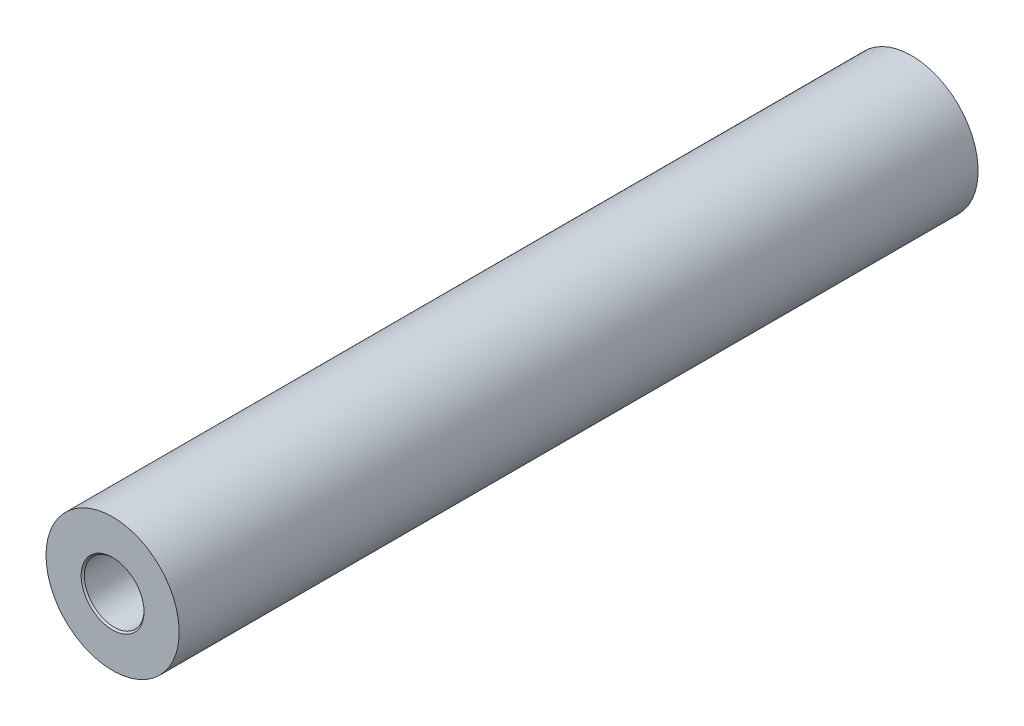
ISO-10303-21;
HEADER;
FILE_DESCRIPTION(('STEP AP214'),'2;1');
FILE_NAME('part.step','',(''),(''),'','','');
FILE_SCHEMA(('AUTOMOTIVE_DESIGN { 1 0 10303 214 1 1 1 1 }'));
ENDSEC;
DATA;
#1=APPLICATION_CONTEXT('core data for automotive mechanical design processes');
#2=APPLICATION_PROTOCOL_DEFINITION('international standard','automotive_design',2000,#1);
#3=PRODUCT_CONTEXT('',#1,'mechanical');
#4=PRODUCT('Part','Part','',(#3));
#5=PRODUCT_RELATED_PRODUCT_CATEGORY('part','',(#4));
#6=PRODUCT_DEFINITION_FORMATION('','',#4);
#7=PRODUCT_DEFINITION_CONTEXT('part definition',#1,'design');
#8=PRODUCT_DEFINITION('design','',#6,#7);
#9=PRODUCT_DEFINITION_SHAPE('','',#8);
#10=(LENGTH_UNIT() NAMED_UNIT(*) SI_UNIT(.MILLI.,.METRE.));
#11=(NAMED_UNIT(*) PLANE_ANGLE_UNIT() SI_UNIT($,.RADIAN.));
#12=(NAMED_UNIT(*) SI_UNIT($,.STERADIAN.) SOLID_ANGLE_UNIT());
#13=UNCERTAINTY_MEASURE_WITH_UNIT(LENGTH_MEASURE(1.E-05),#10,'distance_accuracy_value','');
#14=(GEOMETRIC_REPRESENTATION_CONTEXT(3) GLOBAL_UNCERTAINTY_ASSIGNED_CONTEXT((#13)) GLOBAL_UNIT_ASSIGNED_CONTEXT((#10,
#11,#12)) REPRESENTATION_CONTEXT('',''));
#15=CARTESIAN_POINT('',(0.,0.,0.));
#16=DIRECTION('',(0.,0.,1.));
#17=DIRECTION('',(1.,0.,0.));
#18=AXIS2_PLACEMENT_3D('',#15,#16,#17);
#19=CARTESIAN_POINT('',(0.,0.,19.0499999999999));
#20=DIRECTION('',(0.,0.,-0.999999999999998));
#21=DIRECTION('',(-1.,0.,0.));
#22=AXIS2_PLACEMENT_3D('',#19,#20,#21);
#23=CYLINDRICAL_SURFACE('',#22,3.175);
#24=CARTESIAN_POINT('',(0.,0.,19.0499999999999));
#25=DIRECTION('',(0.,0.,0.999999999999998));
#26=DIRECTION('',(1.,0.,0.));
#27=AXIS2_PLACEMENT_3D('',#24,#25,#26);
#28=CIRCLE('',#27,3.175);
#29=CARTESIAN_POINT('',(-3.17500000000005,0.,19.0499999999999));
#30=VERTEX_POINT('',#29);
#31=EDGE_CURVE('E12',#30,#30,#28,.T.);
#32=CARTESIAN_POINT('',(0.,0.,-19.0499999999999));
#33=DIRECTION('',(0.,0.,0.999999999999998));
#34=DIRECTION('',(1.,0.,0.));
#35=AXIS2_PLACEMENT_3D('',#32,#33,#34);
#36=CIRCLE('',#35,3.175);
#37=CARTESIAN_POINT('',(-3.17500000000006,0.,-19.0499999999999));
#38=VERTEX_POINT('',#37);
#39=EDGE_CURVE('E52',#38,#38,#36,.T.);
#40=CARTESIAN_POINT('',(-3.17500000000005,0.,19.0499999999999));
#41=CARTESIAN_POINT('',(-3.17500000000005,0.,18.6531249999999));
#42=CARTESIAN_POINT('',(-3.17500000000005,0.,18.2562499999999));
#43=CARTESIAN_POINT('',(-3.17500000000005,0.,17.4624999999999));
#44=CARTESIAN_POINT('',(-3.17500000000005,0.,17.0656249999999));
#45=CARTESIAN_POINT('',(-3.17500000000005,0.,16.2718749999999));
#46=CARTESIAN_POINT('',(-3.17500000000005,0.,15.875));
#47=CARTESIAN_POINT('',(-3.17500000000005,0.,15.08125));
#48=CARTESIAN_POINT('',(-3.17500000000006,0.,14.684375));
#49=CARTESIAN_POINT('',(-3.17500000000006,0.,13.890625));
#50=CARTESIAN_POINT('',(-3.17500000000006,0.,13.49375));
#51=CARTESIAN_POINT('',(-3.17500000000006,0.,12.7));
#52=CARTESIAN_POINT('',(-3.17500000000006,0.,12.303125));
#53=CARTESIAN_POINT('',(-3.17500000000006,0.,11.509375));
#54=CARTESIAN_POINT('',(-3.17500000000006,0.,11.1125));
#55=CARTESIAN_POINT('',(-3.17500000000006,0.,10.31875));
#56=CARTESIAN_POINT('',(-3.17500000000006,0.,9.92187499999997));
#57=CARTESIAN_POINT('',(-3.17500000000006,0.,9.12812499999997));
#58=CARTESIAN_POINT('',(-3.17500000000006,0.,8.73124999999998));
#59=CARTESIAN_POINT('',(-3.17500000000006,0.,7.93749999999998));
#60=CARTESIAN_POINT('',(-3.17500000000006,0.,7.54062499999998));
#61=CARTESIAN_POINT('',(-3.17500000000006,0.,6.74687499999998));
#62=CARTESIAN_POINT('',(-3.17500000000006,0.,6.34999999999999));
#63=CARTESIAN_POINT('',(-3.17500000000006,0.,5.55624999999999));
#64=CARTESIAN_POINT('',(-3.17500000000006,0.,5.15937499999999));
#65=CARTESIAN_POINT('',(-3.17500000000006,0.,4.36562499999999));
#66=CARTESIAN_POINT('',(-3.17500000000006,0.,3.96874999999999));
#67=CARTESIAN_POINT('',(-3.17500000000006,0.,3.175));
#68=CARTESIAN_POINT('',(-3.17500000000006,0.,2.778125));
#69=CARTESIAN_POINT('',(-3.17500000000006,0.,1.984375));
#70=CARTESIAN_POINT('',(-3.17500000000006,0.,1.5875));
#71=CARTESIAN_POINT('',(-3.17500000000006,0.,0.793750000000003));
#72=CARTESIAN_POINT('',(-3.17500000000006,0.,0.396875000000005));
#73=CARTESIAN_POINT('',(-3.17500000000006,0.,-0.396874999999991));
#74=CARTESIAN_POINT('',(-3.17500000000006,0.,-0.793749999999989));
#75=CARTESIAN_POINT('',(-3.17500000000006,0.,-1.58749999999999));
#76=CARTESIAN_POINT('',(-3.17500000000006,0.,-1.98437499999999));
#77=CARTESIAN_POINT('',(-3.17500000000006,0.,-2.77812499999999));
#78=CARTESIAN_POINT('',(-3.17500000000006,0.,-3.17499999999998));
#79=CARTESIAN_POINT('',(-3.17500000000006,0.,-3.96874999999998));
#80=CARTESIAN_POINT('',(-3.17500000000006,0.,-4.36562499999998));
#81=CARTESIAN_POINT('',(-3.17500000000006,0.,-5.15937499999998));
#82=CARTESIAN_POINT('',(-3.17500000000006,0.,-5.55624999999997));
#83=CARTESIAN_POINT('',(-3.17500000000006,0.,-6.34999999999997));
#84=CARTESIAN_POINT('',(-3.17500000000006,0.,-6.74687499999997));
#85=CARTESIAN_POINT('',(-3.17500000000006,0.,-7.54062499999997));
#86=CARTESIAN_POINT('',(-3.17500000000006,0.,-7.93749999999997));
#87=CARTESIAN_POINT('',(-3.17500000000006,0.,-8.73124999999997));
#88=CARTESIAN_POINT('',(-3.17500000000006,0.,-9.12812499999996));
#89=CARTESIAN_POINT('',(-3.17500000000006,0.,-9.92187499999996));
#90=CARTESIAN_POINT('',(-3.17500000000006,0.,-10.31875));
#91=CARTESIAN_POINT('',(-3.17500000000006,0.,-11.1125));
#92=CARTESIAN_POINT('',(-3.17500000000006,0.,-11.509375));
#93=CARTESIAN_POINT('',(-3.17500000000006,0.,-12.303125));
#94=CARTESIAN_POINT('',(-3.17500000000006,0.,-12.6999999999999));
#95=CARTESIAN_POINT('',(-3.17500000000006,0.,-13.4937499999999));
#96=CARTESIAN_POINT('',(-3.17500000000006,0.,-13.8906249999999));
#97=CARTESIAN_POINT('',(-3.17500000000006,0.,-14.6843749999999));
#98=CARTESIAN_POINT('',(-3.17500000000006,0.,-15.0812499999999));
#99=CARTESIAN_POINT('',(-3.17500000000006,0.,-15.8749999999999));
#100=CARTESIAN_POINT('',(-3.17500000000006,0.,-16.2718749999999));
#101=CARTESIAN_POINT('',(-3.17500000000006,0.,-17.0656249999999));
#102=CARTESIAN_POINT('',(-3.17500000000006,0.,-17.4624999999999));
#103=CARTESIAN_POINT('',(-3.17500000000006,0.,-18.2562499999999));
#104=CARTESIAN_POINT('',(-3.17500000000006,0.,-18.6531249999999));
#105=CARTESIAN_POINT('',(-3.17500000000006,0.,-19.0499999999999));
#106=B_SPLINE_CURVE_WITH_KNOTS('',3,(#40,#41,#42,#43,#44,#45,#46,#47,#48,#49,#50,#51,#52,#53,
#54,#55,#56,#57,#58,#59,#60,#61,#62,#63,#64,#65,#66,#67,#68,#69,#70,#71,#72,#73,#74,#75,#76,#77,
#78,#79,#80,#81,#82,#83,#84,#85,#86,#87,#88,#89,#90,#91,#92,#93,#94,#95,#96,#97,#98,#99,#100,
#101,#102,#103,#104,#105),.UNSPECIFIED.,.F.,.F.,(4,2,2,2,2,2,2,2,2,2,2,2,2,2,2,2,2,2,2,2,2,2,2,
2,2,2,2,2,2,2,2,2,4),(0.,1.19062499999999,2.38124999999999,3.57187499999998,4.76249999999998,
5.95312499999998,7.14374999999997,8.33437499999997,9.52499999999996,10.715625,11.90625,
13.096875,14.2874999999999,15.4781249999999,16.6687499999999,17.8593749999999,19.0499999999999,
20.2406249999999,21.4312499999999,22.6218749999999,23.8124999999999,25.0031249999999,
26.1937499999999,27.3843749999999,28.5749999999999,29.7656249999999,30.9562499999999,
32.1468749999999,33.3374999999999,34.5281249999999,35.7187499999999,36.9093749999999,
38.0999999999999),.UNSPECIFIED.);
#107=EDGE_CURVE('BSEAM46',#30,#38,#106,.T.);
#108=ORIENTED_EDGE('',*,*,#31,.F.);
#109=ORIENTED_EDGE('',*,*,#39,.T.);
#110=ORIENTED_EDGE('',*,*,#107,.T.);
#111=ORIENTED_EDGE('',*,*,#107,.F.);
#112=EDGE_LOOP('',(#108,#110,#109,#111));
#113=FACE_BOUND('',#112,.T.);
#114=ADVANCED_FACE('F46',(#113),#23,.T.);
#115=CARTESIAN_POINT('',(0.,0.,19.0499999999999));
#116=DIRECTION('',(0.,0.,0.999999999999998));
#117=DIRECTION('',(1.,0.,0.));
#118=AXIS2_PLACEMENT_3D('',#115,#116,#117);
#119=PLANE('',#118);
#120=CARTESIAN_POINT('',(0.,0.,19.0499999999999));
#121=DIRECTION('',(0.,0.,0.999999999999998));
#122=DIRECTION('',(1.,0.,0.));
#123=AXIS2_PLACEMENT_3D('',#120,#121,#122);
#124=CIRCLE('',#123,1.4986);
#125=CARTESIAN_POINT('',(1.49859999999994,0.,19.0499999999999));
#126=VERTEX_POINT('',#125);
#127=EDGE_CURVE('E74',#126,#126,#124,.T.);
#128=ORIENTED_EDGE('',*,*,#127,.F.);
#129=EDGE_LOOP('',(#128));
#130=FACE_BOUND('',#129,.T.);
#131=ORIENTED_EDGE('',*,*,#31,.T.);
#132=EDGE_LOOP('',(#131));
#133=FACE_BOUND('',#132,.T.);
#134=ADVANCED_FACE('F80',(#130,#133),#119,.T.);
#135=CARTESIAN_POINT('',(0.,0.,-19.0499999999999));
#136=DIRECTION('',(0.,0.,0.999999999999998));
#137=DIRECTION('',(1.,0.,0.));
#138=AXIS2_PLACEMENT_3D('',#135,#136,#137);
#139=PLANE('',#138);
#140=CARTESIAN_POINT('',(0.,0.,-19.0499999999999));
#141=DIRECTION('',(0.,0.,-0.999999999999998));
#142=DIRECTION('',(-1.,0.,0.));
#143=AXIS2_PLACEMENT_3D('',#140,#141,#142);
#144=CIRCLE('',#143,1.4986);
#145=CARTESIAN_POINT('',(-1.4986,0.,-19.0499999999999));
#146=VERTEX_POINT('',#145);
#147=EDGE_CURVE('E65',#146,#146,#144,.T.);
#148=ORIENTED_EDGE('',*,*,#147,.F.);
#149=EDGE_LOOP('',(#148));
#150=FACE_BOUND('',#149,.T.);
#151=ORIENTED_EDGE('',*,*,#39,.F.);
#152=EDGE_LOOP('',(#151));
#153=FACE_BOUND('',#152,.T.);
#154=ADVANCED_FACE('F82',(#150,#153),#139,.F.);
#155=CARTESIAN_POINT('',(0.,0.,-12.7));
#156=DIRECTION('',(0.,0.,-0.999999999999998));
#157=DIRECTION('',(-1.,0.,0.));
#158=AXIS2_PLACEMENT_3D('',#155,#156,#157);
#159=CYLINDRICAL_SURFACE('',#158,1.4224);
#160=CARTESIAN_POINT('',(0.,0.,-18.9737999999999));
#161=DIRECTION('',(0.,0.,-0.999999999999998));
#162=DIRECTION('',(-1.,0.,0.));
#163=AXIS2_PLACEMENT_3D('',#160,#161,#162);
#164=CIRCLE('',#163,1.4224);
#165=CARTESIAN_POINT('',(-1.42240000000005,0.,-18.9737999999999));
#166=VERTEX_POINT('',#165);
#167=EDGE_CURVE('E56',#166,#166,#164,.T.);
#168=CARTESIAN_POINT('',(0.,0.,-12.7));
#169=DIRECTION('',(0.,0.,-0.999999999999998));
#170=DIRECTION('',(-1.,0.,0.));
#171=AXIS2_PLACEMENT_3D('',#168,#169,#170);
#172=CIRCLE('',#171,1.4224);
#173=CARTESIAN_POINT('',(-1.42240000000005,0.,-12.7));
#174=VERTEX_POINT('',#173);
#175=EDGE_CURVE('E60',#174,#174,#172,.T.);
#176=CARTESIAN_POINT('',(-1.42240000000005,0.,-18.9737999999999));
#177=CARTESIAN_POINT('',(-1.42240000000005,0.,-18.9084479166666));
#178=CARTESIAN_POINT('',(-1.42240000000005,0.,-18.8430958333333));
#179=CARTESIAN_POINT('',(-1.42240000000005,0.,-18.7123916666666));
#180=CARTESIAN_POINT('',(-1.42240000000005,0.,-18.6470395833333));
#181=CARTESIAN_POINT('',(-1.42240000000005,0.,-18.5163354166666));
#182=CARTESIAN_POINT('',(-1.42240000000005,0.,-18.4509833333333));
#183=CARTESIAN_POINT('',(-1.42240000000005,0.,-18.3202791666666));
#184=CARTESIAN_POINT('',(-1.42240000000005,0.,-18.2549270833333));
#185=CARTESIAN_POINT('',(-1.42240000000005,0.,-18.1242229166666));
#186=CARTESIAN_POINT('',(-1.42240000000005,0.,-18.0588708333333));
#187=CARTESIAN_POINT('',(-1.42240000000005,0.,-17.9281666666666));
#188=CARTESIAN_POINT('',(-1.42240000000005,0.,-17.8628145833333));
#189=CARTESIAN_POINT('',(-1.42240000000005,0.,-17.7321104166666));
#190=CARTESIAN_POINT('',(-1.42240000000005,0.,-17.6667583333333));
#191=CARTESIAN_POINT('',(-1.42240000000005,0.,-17.5360541666666));
#192=CARTESIAN_POINT('',(-1.42240000000005,0.,-17.4707020833333));
#193=CARTESIAN_POINT('',(-1.42240000000005,0.,-17.3399979166666));
#194=CARTESIAN_POINT('',(-1.42240000000005,0.,-17.2746458333333));
#195=CARTESIAN_POINT('',(-1.42240000000005,0.,-17.1439416666666));
#196=CARTESIAN_POINT('',(-1.42240000000005,0.,-17.0785895833333));
#197=CARTESIAN_POINT('',(-1.42240000000005,0.,-16.9478854166666));
#198=CARTESIAN_POINT('',(-1.42240000000005,0.,-16.8825333333333));
#199=CARTESIAN_POINT('',(-1.42240000000005,0.,-16.7518291666666));
#200=CARTESIAN_POINT('',(-1.42240000000005,0.,-16.6864770833333));
#201=CARTESIAN_POINT('',(-1.42240000000005,0.,-16.5557729166666));
#202=CARTESIAN_POINT('',(-1.42240000000005,0.,-16.4904208333333));
#203=CARTESIAN_POINT('',(-1.42240000000005,0.,-16.3597166666666));
#204=CARTESIAN_POINT('',(-1.42240000000005,0.,-16.2943645833333));
#205=CARTESIAN_POINT('',(-1.42240000000005,0.,-16.1636604166666));
#206=CARTESIAN_POINT('',(-1.42240000000005,0.,-16.0983083333333));
#207=CARTESIAN_POINT('',(-1.42240000000005,0.,-15.9676041666666));
#208=CARTESIAN_POINT('',(-1.42240000000005,0.,-15.9022520833333));
#209=CARTESIAN_POINT('',(-1.42240000000005,0.,-15.7715479166666));
#210=CARTESIAN_POINT('',(-1.42240000000005,0.,-15.7061958333333));
#211=CARTESIAN_POINT('',(-1.42240000000005,0.,-15.5754916666666));
#212=CARTESIAN_POINT('',(-1.42240000000005,0.,-15.5101395833333));
#213=CARTESIAN_POINT('',(-1.42240000000005,0.,-15.3794354166666));
#214=CARTESIAN_POINT('',(-1.42240000000005,0.,-15.3140833333333));
#215=CARTESIAN_POINT('',(-1.42240000000005,0.,-15.1833791666666));
#216=CARTESIAN_POINT('',(-1.42240000000005,0.,-15.1180270833333));
#217=CARTESIAN_POINT('',(-1.42240000000005,0.,-14.9873229166666));
#218=CARTESIAN_POINT('',(-1.42240000000005,0.,-14.9219708333333));
#219=CARTESIAN_POINT('',(-1.42240000000005,0.,-14.7912666666666));
#220=CARTESIAN_POINT('',(-1.42240000000005,0.,-14.7259145833333));
#221=CARTESIAN_POINT('',(-1.42240000000005,0.,-14.5952104166666));
#222=CARTESIAN_POINT('',(-1.42240000000005,0.,-14.5298583333333));
#223=CARTESIAN_POINT('',(-1.42240000000005,0.,-14.3991541666666));
#224=CARTESIAN_POINT('',(-1.42240000000005,0.,-14.3338020833333));
#225=CARTESIAN_POINT('',(-1.42240000000005,0.,-14.2030979166666));
#226=CARTESIAN_POINT('',(-1.42240000000005,0.,-14.1377458333333));
#227=CARTESIAN_POINT('',(-1.42240000000005,0.,-14.0070416666666));
#228=CARTESIAN_POINT('',(-1.42240000000005,0.,-13.9416895833333));
#229=CARTESIAN_POINT('',(-1.42240000000005,0.,-13.8109854166666));
#230=CARTESIAN_POINT('',(-1.42240000000005,0.,-13.7456333333333));
#231=CARTESIAN_POINT('',(-1.42240000000005,0.,-13.6149291666666));
#232=CARTESIAN_POINT('',(-1.42240000000005,0.,-13.5495770833333));
#233=CARTESIAN_POINT('',(-1.42240000000005,0.,-13.4188729166666));
#234=CARTESIAN_POINT('',(-1.42240000000005,0.,-13.3535208333333));
#235=CARTESIAN_POINT('',(-1.42240000000005,0.,-13.2228166666666));
#236=CARTESIAN_POINT('',(-1.42240000000005,0.,-13.1574645833333));
#237=CARTESIAN_POINT('',(-1.42240000000005,0.,-13.0267604166666));
#238=CARTESIAN_POINT('',(-1.42240000000005,0.,-12.9614083333333));
#239=CARTESIAN_POINT('',(-1.42240000000005,0.,-12.8307041666666));
#240=CARTESIAN_POINT('',(-1.42240000000005,0.,-12.7653520833333));
#241=CARTESIAN_POINT('',(-1.42240000000005,0.,-12.7));
#242=B_SPLINE_CURVE_WITH_KNOTS('',3,(#176,#177,#178,#179,#180,#181,#182,#183,#184,#185,#186,
#187,#188,#189,#190,#191,#192,#193,#194,#195,#196,#197,#198,#199,#200,#201,#202,#203,#204,#205,
#206,#207,#208,#209,#210,#211,#212,#213,#214,#215,#216,#217,#218,#219,#220,#221,#222,#223,#224,
#225,#226,#227,#228,#229,#230,#231,#232,#233,#234,#235,#236,#237,#238,#239,#240,#241),
.UNSPECIFIED.,.F.,.F.,(4,2,2,2,2,2,2,2,2,2,2,2,2,2,2,2,2,2,2,2,2,2,2,2,2,2,2,2,2,2,2,2,4),(0.,
0.196056249999996,0.392112499999996,0.588168749999996,0.784224999999993,0.980281249999992,
1.17633749999999,1.37239374999999,1.56844999999999,1.76450624999999,1.96056249999999,
2.15661874999998,2.35267499999998,2.54873124999998,2.74478749999998,2.94084374999998,
3.13689999999998,3.33295624999998,3.52901249999998,3.72506874999998,3.92112499999998,
4.11718124999997,4.31323749999997,4.50929374999997,4.70534999999997,4.90140624999997,
5.09746249999997,5.29351874999997,5.48957499999997,5.68563124999997,5.88168749999997,
6.07774374999996,6.27379999999996),.UNSPECIFIED.);
#243=EDGE_CURVE('BSEAM87',#166,#174,#242,.T.);
#244=ORIENTED_EDGE('',*,*,#167,.T.);
#245=ORIENTED_EDGE('',*,*,#175,.F.);
#246=ORIENTED_EDGE('',*,*,#243,.T.);
#247=ORIENTED_EDGE('',*,*,#243,.F.);
#248=EDGE_LOOP('',(#244,#246,#245,#247));
#249=FACE_BOUND('',#248,.T.);
#250=ADVANCED_FACE('F87',(#249),#159,.F.);
#251=CARTESIAN_POINT('',(0.,0.,-12.7));
#252=DIRECTION('',(0.,0.,-0.999999999999998));
#253=DIRECTION('',(-1.,0.,0.));
#254=AXIS2_PLACEMENT_3D('',#251,#252,#253);
#255=PLANE('',#254);
#256=ORIENTED_EDGE('',*,*,#175,.T.);
#257=EDGE_LOOP('',(#256));
#258=FACE_BOUND('',#257,.T.);
#259=ADVANCED_FACE('F94',(#258),#255,.T.);
#260=CARTESIAN_POINT('',(0.,0.,-19.0499999999999));
#261=DIRECTION('',(0.,0.,-0.999999999999998));
#262=DIRECTION('',(-1.,0.,0.));
#263=AXIS2_PLACEMENT_3D('',#260,#261,#262);
#264=CONICAL_SURFACE('',#263,1.4986,0.78539816339745);
#265=CARTESIAN_POINT('',(-1.4224,0.,-18.9737999999999));
#266=CARTESIAN_POINT('',(-1.42319375,0.,-18.9745937499999));
#267=CARTESIAN_POINT('',(-1.4239875,0.,-18.9753874999999));
#268=CARTESIAN_POINT('',(-1.425575,0.,-18.9769749999999));
#269=CARTESIAN_POINT('',(-1.42636875,0.,-18.9777687499999));
#270=CARTESIAN_POINT('',(-1.42795625,0.,-18.9793562499999));
#271=CARTESIAN_POINT('',(-1.42875,0.,-18.9801499999999));
#272=CARTESIAN_POINT('',(-1.4303375,0.,-18.9817374999999));
#273=CARTESIAN_POINT('',(-1.43113125,0.,-18.9825312499999));
#274=CARTESIAN_POINT('',(-1.43271875,0.,-18.9841187499999));
#275=CARTESIAN_POINT('',(-1.4335125,0.,-18.9849124999999));
#276=CARTESIAN_POINT('',(-1.4351,0.,-18.9864999999999));
#277=CARTESIAN_POINT('',(-1.43589375,0.,-18.9872937499999));
#278=CARTESIAN_POINT('',(-1.43748125,0.,-18.9888812499999));
#279=CARTESIAN_POINT('',(-1.438275,0.,-18.9896749999999));
#280=CARTESIAN_POINT('',(-1.4398625,0.,-18.9912624999999));
#281=CARTESIAN_POINT('',(-1.44065625,0.,-18.9920562499999));
#282=CARTESIAN_POINT('',(-1.44224375,0.,-18.9936437499999));
#283=CARTESIAN_POINT('',(-1.4430375,0.,-18.9944374999999));
#284=CARTESIAN_POINT('',(-1.444625,0.,-18.9960249999999));
#285=CARTESIAN_POINT('',(-1.44541875,0.,-18.9968187499999));
#286=CARTESIAN_POINT('',(-1.44700625,0.,-18.9984062499999));
#287=CARTESIAN_POINT('',(-1.4478,0.,-18.9991999999999));
#288=CARTESIAN_POINT('',(-1.4493875,0.,-19.0007874999999));
#289=CARTESIAN_POINT('',(-1.45018125,0.,-19.0015812499999));
#290=CARTESIAN_POINT('',(-1.45176875,0.,-19.0031687499999));
#291=CARTESIAN_POINT('',(-1.4525625,0.,-19.0039624999999));
#292=CARTESIAN_POINT('',(-1.45415,0.,-19.0055499999999));
#293=CARTESIAN_POINT('',(-1.45494375,0.,-19.0063437499999));
#294=CARTESIAN_POINT('',(-1.45653125,0.,-19.0079312499999));
#295=CARTESIAN_POINT('',(-1.457325,0.,-19.0087249999999));
#296=CARTESIAN_POINT('',(-1.4589125,0.,-19.0103124999999));
#297=CARTESIAN_POINT('',(-1.45970625,0.,-19.0111062499999));
#298=CARTESIAN_POINT('',(-1.46129375,0.,-19.0126937499999));
#299=CARTESIAN_POINT('',(-1.4620875,0.,-19.0134874999999));
#300=CARTESIAN_POINT('',(-1.463675,0.,-19.0150749999999));
#301=CARTESIAN_POINT('',(-1.46446875,0.,-19.0158687499999));
#302=CARTESIAN_POINT('',(-1.46605625,0.,-19.0174562499999));
#303=CARTESIAN_POINT('',(-1.46685,0.,-19.0182499999999));
#304=CARTESIAN_POINT('',(-1.4684375,0.,-19.0198374999999));
#305=CARTESIAN_POINT('',(-1.46923125,0.,-19.0206312499999));
#306=CARTESIAN_POINT('',(-1.47081875,0.,-19.0222187499999));
#307=CARTESIAN_POINT('',(-1.4716125,0.,-19.0230124999999));
#308=CARTESIAN_POINT('',(-1.4732,0.,-19.0245999999999));
#309=CARTESIAN_POINT('',(-1.47399375,0.,-19.0253937499999));
#310=CARTESIAN_POINT('',(-1.47558125,0.,-19.0269812499999));
#311=CARTESIAN_POINT('',(-1.476375,0.,-19.0277749999999));
#312=CARTESIAN_POINT('',(-1.4779625,0.,-19.0293624999999));
#313=CARTESIAN_POINT('',(-1.47875625,0.,-19.0301562499999));
#314=CARTESIAN_POINT('',(-1.48034375,0.,-19.0317437499999));
#315=CARTESIAN_POINT('',(-1.4811375,0.,-19.0325374999999));
#316=CARTESIAN_POINT('',(-1.482725,0.,-19.0341249999999));
#317=CARTESIAN_POINT('',(-1.48351875,0.,-19.0349187499999));
#318=CARTESIAN_POINT('',(-1.48510625,0.,-19.0365062499999));
#319=CARTESIAN_POINT('',(-1.4859,0.,-19.0372999999999));
#320=CARTESIAN_POINT('',(-1.4874875,0.,-19.0388874999999));
#321=CARTESIAN_POINT('',(-1.48828125,0.,-19.0396812499999));
#322=CARTESIAN_POINT('',(-1.48986875,0.,-19.0412687499999));
#323=CARTESIAN_POINT('',(-1.4906625,0.,-19.0420624999999));
#324=CARTESIAN_POINT('',(-1.49225,0.,-19.0436499999999));
#325=CARTESIAN_POINT('',(-1.49304375,0.,-19.0444437499999));
#326=CARTESIAN_POINT('',(-1.49463125,0.,-19.0460312499999));
#327=CARTESIAN_POINT('',(-1.495425,0.,-19.0468249999999));
#328=CARTESIAN_POINT('',(-1.4970125,0.,-19.0484124999999));
#329=CARTESIAN_POINT('',(-1.49780625,0.,-19.0492062499999));
#330=CARTESIAN_POINT('',(-1.4986,0.,-19.0499999999999));
#331=B_SPLINE_CURVE_WITH_KNOTS('',3,(#265,#266,#267,#268,#269,#270,#271,#272,#273,#274,#275,
#276,#277,#278,#279,#280,#281,#282,#283,#284,#285,#286,#287,#288,#289,#290,#291,#292,#293,#294,
#295,#296,#297,#298,#299,#300,#301,#302,#303,#304,#305,#306,#307,#308,#309,#310,#311,#312,#313,
#314,#315,#316,#317,#318,#319,#320,#321,#322,#323,#324,#325,#326,#327,#328,#329,#330),
.UNSPECIFIED.,.F.,.F.,(4,2,2,2,2,2,2,2,2,2,2,2,2,2,2,2,2,2,2,2,2,2,2,2,2,2,2,2,2,2,2,2,4),(0.,
0.00336759604540271,0.00673519209080296,0.0101027881362032,0.0134703841816059,
0.0168379802270062,0.0202055762724064,0.0235731723178067,0.0269407683632094,0.0303083644086098,
0.03367596045401,0.0370435564994103,0.040411152544813,0.0437787485902133,0.0471463446356135,
0.0505139406810138,0.053881536726414,0.0572491327718167,0.0606167288172168,0.0639843248626171,
0.0673519209080198,0.07071951695342,0.0740871129988203,0.0774547090442205,0.0808223050896209,
0.0841899011350236,0.0875574971804239,0.0909250932258241,0.0942926892712244,0.0976602853166271,
0.101027881362027,0.104395477407428,0.10776307345283),.UNSPECIFIED.);
#332=EDGE_CURVE('BSEAM98',#166,#146,#331,.T.);
#333=ORIENTED_EDGE('',*,*,#167,.F.);
#334=ORIENTED_EDGE('',*,*,#147,.T.);
#335=ORIENTED_EDGE('',*,*,#332,.T.);
#336=ORIENTED_EDGE('',*,*,#332,.F.);
#337=EDGE_LOOP('',(#333,#335,#334,#336));
#338=FACE_BOUND('',#337,.T.);
#339=ADVANCED_FACE('F98',(#338),#264,.F.);
#340=CARTESIAN_POINT('',(0.,0.,12.6999999999999));
#341=DIRECTION('',(0.,0.,0.999999999999998));
#342=DIRECTION('',(1.,0.,0.));
#343=AXIS2_PLACEMENT_3D('',#340,#341,#342);
#344=CYLINDRICAL_SURFACE('',#343,1.4224);
#345=CARTESIAN_POINT('',(0.,0.,18.9737999999999));
#346=DIRECTION('',(0.,0.,0.999999999999998));
#347=DIRECTION('',(1.,0.,0.));
#348=AXIS2_PLACEMENT_3D('',#345,#346,#347);
#349=CIRCLE('',#348,1.4224);
#350=CARTESIAN_POINT('',(1.42239999999996,0.,18.9737999999999));
#351=VERTEX_POINT('',#350);
#352=EDGE_CURVE('E68',#351,#351,#349,.T.);
#353=CARTESIAN_POINT('',(0.,0.,12.6999999999999));
#354=DIRECTION('',(0.,0.,0.999999999999998));
#355=DIRECTION('',(1.,0.,0.));
#356=AXIS2_PLACEMENT_3D('',#353,#354,#355);
#357=CIRCLE('',#356,1.4224);
#358=CARTESIAN_POINT('',(1.42239999999996,0.,12.6999999999999));
#359=VERTEX_POINT('',#358);
#360=EDGE_CURVE('E71',#359,#359,#357,.T.);
#361=CARTESIAN_POINT('',(1.42239999999996,0.,18.9737999999999));
#362=CARTESIAN_POINT('',(1.42239999999996,0.,18.9084479166666));
#363=CARTESIAN_POINT('',(1.42239999999996,0.,18.8430958333333));
#364=CARTESIAN_POINT('',(1.42239999999996,0.,18.7123916666666));
#365=CARTESIAN_POINT('',(1.42239999999996,0.,18.6470395833333));
#366=CARTESIAN_POINT('',(1.42239999999996,0.,18.5163354166666));
#367=CARTESIAN_POINT('',(1.42239999999996,0.,18.4509833333333));
#368=CARTESIAN_POINT('',(1.42239999999996,0.,18.3202791666666));
#369=CARTESIAN_POINT('',(1.42239999999996,0.,18.2549270833333));
#370=CARTESIAN_POINT('',(1.42239999999996,0.,18.1242229166666));
#371=CARTESIAN_POINT('',(1.42239999999996,0.,18.0588708333333));
#372=CARTESIAN_POINT('',(1.42239999999996,0.,17.9281666666666));
#373=CARTESIAN_POINT('',(1.42239999999996,0.,17.8628145833333));
#374=CARTESIAN_POINT('',(1.42239999999996,0.,17.7321104166666));
#375=CARTESIAN_POINT('',(1.42239999999996,0.,17.6667583333333));
#376=CARTESIAN_POINT('',(1.42239999999996,0.,17.5360541666666));
#377=CARTESIAN_POINT('',(1.42239999999996,0.,17.4707020833333));
#378=CARTESIAN_POINT('',(1.42239999999996,0.,17.3399979166666));
#379=CARTESIAN_POINT('',(1.42239999999996,0.,17.2746458333333));
#380=CARTESIAN_POINT('',(1.42239999999996,0.,17.1439416666666));
#381=CARTESIAN_POINT('',(1.42239999999996,0.,17.0785895833333));
#382=CARTESIAN_POINT('',(1.42239999999996,0.,16.9478854166666));
#383=CARTESIAN_POINT('',(1.42239999999996,0.,16.8825333333333));
#384=CARTESIAN_POINT('',(1.42239999999996,0.,16.7518291666666));
#385=CARTESIAN_POINT('',(1.42239999999996,0.,16.6864770833333));
#386=CARTESIAN_POINT('',(1.42239999999996,0.,16.5557729166666));
#387=CARTESIAN_POINT('',(1.42239999999996,0.,16.4904208333333));
#388=CARTESIAN_POINT('',(1.42239999999996,0.,16.3597166666666));
#389=CARTESIAN_POINT('',(1.42239999999996,0.,16.2943645833333));
#390=CARTESIAN_POINT('',(1.42239999999996,0.,16.1636604166666));
#391=CARTESIAN_POINT('',(1.42239999999996,0.,16.0983083333333));
#392=CARTESIAN_POINT('',(1.42239999999996,0.,15.9676041666666));
#393=CARTESIAN_POINT('',(1.42239999999996,0.,15.9022520833333));
#394=CARTESIAN_POINT('',(1.42239999999996,0.,15.7715479166666));
#395=CARTESIAN_POINT('',(1.42239999999996,0.,15.7061958333333));
#396=CARTESIAN_POINT('',(1.42239999999996,0.,15.5754916666666));
#397=CARTESIAN_POINT('',(1.42239999999996,0.,15.5101395833333));
#398=CARTESIAN_POINT('',(1.42239999999996,0.,15.3794354166666));
#399=CARTESIAN_POINT('',(1.42239999999996,0.,15.3140833333333));
#400=CARTESIAN_POINT('',(1.42239999999996,0.,15.1833791666666));
#401=CARTESIAN_POINT('',(1.42239999999996,0.,15.1180270833333));
#402=CARTESIAN_POINT('',(1.42239999999996,0.,14.9873229166666));
#403=CARTESIAN_POINT('',(1.42239999999996,0.,14.9219708333333));
#404=CARTESIAN_POINT('',(1.42239999999996,0.,14.7912666666666));
#405=CARTESIAN_POINT('',(1.42239999999996,0.,14.7259145833333));
#406=CARTESIAN_POINT('',(1.42239999999996,0.,14.5952104166666));
#407=CARTESIAN_POINT('',(1.42239999999996,0.,14.5298583333333));
#408=CARTESIAN_POINT('',(1.42239999999996,0.,14.3991541666666));
#409=CARTESIAN_POINT('',(1.42239999999996,0.,14.3338020833333));
#410=CARTESIAN_POINT('',(1.42239999999996,0.,14.2030979166666));
#411=CARTESIAN_POINT('',(1.42239999999996,0.,14.1377458333333));
#412=CARTESIAN_POINT('',(1.42239999999996,0.,14.0070416666666));
#413=CARTESIAN_POINT('',(1.42239999999996,0.,13.9416895833333));
#414=CARTESIAN_POINT('',(1.42239999999996,0.,13.8109854166666));
#415=CARTESIAN_POINT('',(1.42239999999996,0.,13.7456333333333));
#416=CARTESIAN_POINT('',(1.42239999999996,0.,13.6149291666666));
#417=CARTESIAN_POINT('',(1.42239999999996,0.,13.5495770833333));
#418=CARTESIAN_POINT('',(1.42239999999996,0.,13.4188729166666));
#419=CARTESIAN_POINT('',(1.42239999999996,0.,13.3535208333333));
#420=CARTESIAN_POINT('',(1.42239999999996,0.,13.2228166666666));
#421=CARTESIAN_POINT('',(1.42239999999996,0.,13.1574645833333));
#422=CARTESIAN_POINT('',(1.42239999999996,0.,13.0267604166666));
#423=CARTESIAN_POINT('',(1.42239999999996,0.,12.9614083333333));
#424=CARTESIAN_POINT('',(1.42239999999996,0.,12.8307041666666));
#425=CARTESIAN_POINT('',(1.42239999999996,0.,12.7653520833333));
#426=CARTESIAN_POINT('',(1.42239999999996,0.,12.6999999999999));
#427=B_SPLINE_CURVE_WITH_KNOTS('',3,(#361,#362,#363,#364,#365,#366,#367,#368,#369,#370,#371,
#372,#373,#374,#375,#376,#377,#378,#379,#380,#381,#382,#383,#384,#385,#386,#387,#388,#389,#390,
#391,#392,#393,#394,#395,#396,#397,#398,#399,#400,#401,#402,#403,#404,#405,#406,#407,#408,#409,
#410,#411,#412,#413,#414,#415,#416,#417,#418,#419,#420,#421,#422,#423,#424,#425,#426),
.UNSPECIFIED.,.F.,.F.,(4,2,2,2,2,2,2,2,2,2,2,2,2,2,2,2,2,2,2,2,2,2,2,2,2,2,2,2,2,2,2,2,4),(0.,
0.19605625,0.3921125,0.58816875,0.784225,0.980281249999999,1.1763375,1.37239375,1.56845,
1.76450625,1.9605625,2.15661875,2.352675,2.54873125,2.7447875,2.94084375,3.1369,3.33295625,
3.5290125,3.72506875,3.921125,4.11718125,4.3132375,4.50929375,4.70535,4.90140625000001,
5.09746250000001,5.29351875,5.48957500000001,5.68563125000001,5.88168750000001,6.07774375000001,
6.27380000000001),.UNSPECIFIED.);
#428=EDGE_CURVE('BSEAM102',#351,#359,#427,.T.);
#429=ORIENTED_EDGE('',*,*,#352,.T.);
#430=ORIENTED_EDGE('',*,*,#360,.F.);
#431=ORIENTED_EDGE('',*,*,#428,.T.);
#432=ORIENTED_EDGE('',*,*,#428,.F.);
#433=EDGE_LOOP('',(#429,#431,#430,#432));
#434=FACE_BOUND('',#433,.T.);
#435=ADVANCED_FACE('F102',(#434),#344,.F.);
#436=CARTESIAN_POINT('',(0.,0.,12.6999999999999));
#437=DIRECTION('',(0.,0.,0.999999999999998));
#438=DIRECTION('',(1.,0.,0.));
#439=AXIS2_PLACEMENT_3D('',#436,#437,#438);
#440=PLANE('',#439);
#441=ORIENTED_EDGE('',*,*,#360,.T.);
#442=EDGE_LOOP('',(#441));
#443=FACE_BOUND('',#442,.T.);
#444=ADVANCED_FACE('F106',(#443),#440,.T.);
#445=CARTESIAN_POINT('',(0.,0.,19.0499999999999));
#446=DIRECTION('',(0.,0.,0.999999999999998));
#447=DIRECTION('',(1.,0.,0.));
#448=AXIS2_PLACEMENT_3D('',#445,#446,#447);
#449=CONICAL_SURFACE('',#448,1.4986,0.78539816339745);
#450=CARTESIAN_POINT('',(1.42239999999994,0.,18.9737999999999));
#451=CARTESIAN_POINT('',(1.42319374999994,0.,18.9745937499999));
#452=CARTESIAN_POINT('',(1.42398749999994,0.,18.9753874999999));
#453=CARTESIAN_POINT('',(1.42557499999994,0.,18.9769749999999));
#454=CARTESIAN_POINT('',(1.42636874999994,0.,18.9777687499999));
#455=CARTESIAN_POINT('',(1.42795624999994,0.,18.9793562499999));
#456=CARTESIAN_POINT('',(1.42874999999994,0.,18.9801499999999));
#457=CARTESIAN_POINT('',(1.43033749999994,0.,18.9817374999999));
#458=CARTESIAN_POINT('',(1.43113124999994,0.,18.9825312499999));
#459=CARTESIAN_POINT('',(1.43271874999994,0.,18.9841187499999));
#460=CARTESIAN_POINT('',(1.43351249999994,0.,18.9849124999999));
#461=CARTESIAN_POINT('',(1.43509999999994,0.,18.9864999999999));
#462=CARTESIAN_POINT('',(1.43589374999994,0.,18.9872937499999));
#463=CARTESIAN_POINT('',(1.43748124999994,0.,18.9888812499999));
#464=CARTESIAN_POINT('',(1.43827499999994,0.,18.9896749999999));
#465=CARTESIAN_POINT('',(1.43986249999994,0.,18.9912624999999));
#466=CARTESIAN_POINT('',(1.44065624999994,0.,18.9920562499999));
#467=CARTESIAN_POINT('',(1.44224374999994,0.,18.9936437499999));
#468=CARTESIAN_POINT('',(1.44303749999994,0.,18.9944374999999));
#469=CARTESIAN_POINT('',(1.44462499999994,0.,18.9960249999999));
#470=CARTESIAN_POINT('',(1.44541874999994,0.,18.9968187499999));
#471=CARTESIAN_POINT('',(1.44700624999994,0.,18.9984062499999));
#472=CARTESIAN_POINT('',(1.44779999999994,0.,18.9991999999999));
#473=CARTESIAN_POINT('',(1.44938749999994,0.,19.0007874999999));
#474=CARTESIAN_POINT('',(1.45018124999994,0.,19.0015812499999));
#475=CARTESIAN_POINT('',(1.45176874999994,0.,19.0031687499999));
#476=CARTESIAN_POINT('',(1.45256249999994,0.,19.0039624999999));
#477=CARTESIAN_POINT('',(1.45414999999994,0.,19.0055499999999));
#478=CARTESIAN_POINT('',(1.45494374999994,0.,19.0063437499999));
#479=CARTESIAN_POINT('',(1.45653124999994,0.,19.0079312499999));
#480=CARTESIAN_POINT('',(1.45732499999994,0.,19.0087249999999));
#481=CARTESIAN_POINT('',(1.45891249999994,0.,19.0103124999999));
#482=CARTESIAN_POINT('',(1.45970624999994,0.,19.0111062499999));
#483=CARTESIAN_POINT('',(1.46129374999994,0.,19.0126937499999));
#484=CARTESIAN_POINT('',(1.46208749999994,0.,19.0134874999999));
#485=CARTESIAN_POINT('',(1.46367499999994,0.,19.0150749999999));
#486=CARTESIAN_POINT('',(1.46446874999994,0.,19.0158687499999));
#487=CARTESIAN_POINT('',(1.46605624999994,0.,19.0174562499999));
#488=CARTESIAN_POINT('',(1.46684999999994,0.,19.0182499999999));
#489=CARTESIAN_POINT('',(1.46843749999994,0.,19.0198374999999));
#490=CARTESIAN_POINT('',(1.46923124999994,0.,19.0206312499999));
#491=CARTESIAN_POINT('',(1.47081874999994,0.,19.0222187499999));
#492=CARTESIAN_POINT('',(1.47161249999994,0.,19.0230124999999));
#493=CARTESIAN_POINT('',(1.47319999999994,0.,19.0245999999999));
#494=CARTESIAN_POINT('',(1.47399374999994,0.,19.0253937499999));
#495=CARTESIAN_POINT('',(1.47558124999994,0.,19.0269812499999));
#496=CARTESIAN_POINT('',(1.47637499999994,0.,19.0277749999999));
#497=CARTESIAN_POINT('',(1.47796249999994,0.,19.0293624999999));
#498=CARTESIAN_POINT('',(1.47875624999994,0.,19.0301562499999));
#499=CARTESIAN_POINT('',(1.48034374999994,0.,19.0317437499999));
#500=CARTESIAN_POINT('',(1.48113749999994,0.,19.0325374999999));
#501=CARTESIAN_POINT('',(1.48272499999994,0.,19.0341249999999));
#502=CARTESIAN_POINT('',(1.48351874999994,0.,19.0349187499999));
#503=CARTESIAN_POINT('',(1.48510624999994,0.,19.0365062499999));
#504=CARTESIAN_POINT('',(1.48589999999994,0.,19.0372999999999));
#505=CARTESIAN_POINT('',(1.48748749999994,0.,19.0388874999999));
#506=CARTESIAN_POINT('',(1.48828124999994,0.,19.0396812499999));
#507=CARTESIAN_POINT('',(1.48986874999994,0.,19.0412687499999));
#508=CARTESIAN_POINT('',(1.49066249999994,0.,19.0420624999999));
#509=CARTESIAN_POINT('',(1.49224999999994,0.,19.0436499999999));
#510=CARTESIAN_POINT('',(1.49304374999994,0.,19.0444437499999));
#511=CARTESIAN_POINT('',(1.49463124999994,0.,19.0460312499999));
#512=CARTESIAN_POINT('',(1.49542499999994,0.,19.0468249999999));
#513=CARTESIAN_POINT('',(1.49701249999994,0.,19.0484124999999));
#514=CARTESIAN_POINT('',(1.49780624999994,0.,19.0492062499999));
#515=CARTESIAN_POINT('',(1.49859999999994,0.,19.0499999999999));
#516=B_SPLINE_CURVE_WITH_KNOTS('',3,(#450,#451,#452,#453,#454,#455,#456,#457,#458,#459,#460,
#461,#462,#463,#464,#465,#466,#467,#468,#469,#470,#471,#472,#473,#474,#475,#476,#477,#478,#479,
#480,#481,#482,#483,#484,#485,#486,#487,#488,#489,#490,#491,#492,#493,#494,#495,#496,#497,#498,
#499,#500,#501,#502,#503,#504,#505,#506,#507,#508,#509,#510,#511,#512,#513,#514,#515),
.UNSPECIFIED.,.F.,.F.,(4,2,2,2,2,2,2,2,2,2,2,2,2,2,2,2,2,2,2,2,2,2,2,2,2,2,2,2,2,2,2,2,4),(0.,
0.00336759604540271,0.00673519209080296,0.0101027881362032,0.0134703841816059,
0.0168379802270062,0.0202055762724064,0.0235731723178067,0.0269407683632094,0.0303083644086098,
0.03367596045401,0.0370435564994103,0.040411152544813,0.0437787485902133,0.0471463446356135,
0.0505139406810138,0.053881536726414,0.0572491327718167,0.0606167288172168,0.0639843248626171,
0.0673519209080198,0.07071951695342,0.0740871129988203,0.0774547090442205,0.0808223050896209,
0.0841899011350236,0.0875574971804239,0.0909250932258241,0.0942926892712244,0.0976602853166271,
0.101027881362027,0.104395477407428,0.10776307345283),.UNSPECIFIED.);
#517=EDGE_CURVE('BSEAM78',#351,#126,#516,.T.);
#518=ORIENTED_EDGE('',*,*,#352,.F.);
#519=ORIENTED_EDGE('',*,*,#127,.T.);
#520=ORIENTED_EDGE('',*,*,#517,.T.);
#521=ORIENTED_EDGE('',*,*,#517,.F.);
#522=EDGE_LOOP('',(#518,#520,#519,#521));
#523=FACE_BOUND('',#522,.T.);
#524=ADVANCED_FACE('F78',(#523),#449,.F.);
#525=CLOSED_SHELL('',(#114,#134,#154,#250,#259,#339,#435,#444,#524));
#526=MANIFOLD_SOLID_BREP('B2',#525);
#527=ADVANCED_BREP_SHAPE_REPRESENTATION('',(#18,#526),#14);
#528=SHAPE_DEFINITION_REPRESENTATION(#9,#527);
ENDSEC;
END-ISO-10303-21;
